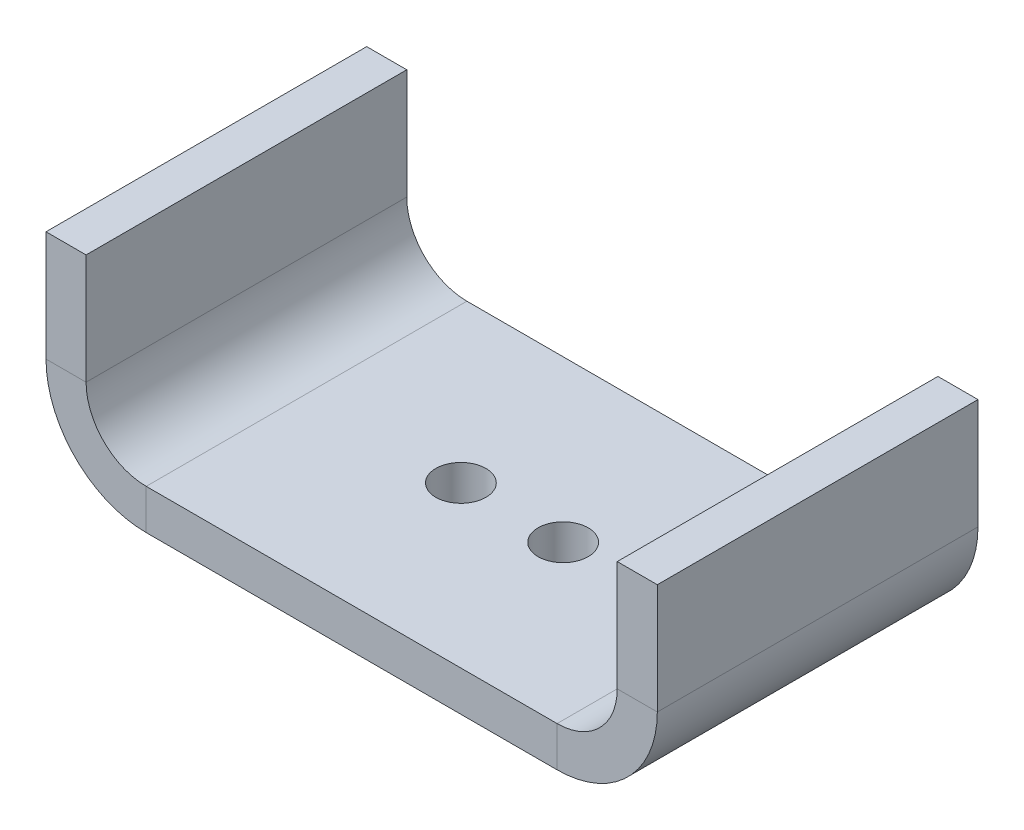
ISO-10303-21;
HEADER;
FILE_DESCRIPTION(('STEP AP214'),'2;1');
FILE_NAME('part.step','',(''),(''),'','','');
FILE_SCHEMA(('AUTOMOTIVE_DESIGN { 1 0 10303 214 1 1 1 1 }'));
ENDSEC;
DATA;
#1=APPLICATION_CONTEXT('core data for automotive mechanical design processes');
#2=APPLICATION_PROTOCOL_DEFINITION('international standard','automotive_design',2000,#1);
#3=PRODUCT_CONTEXT('',#1,'mechanical');
#4=PRODUCT('Part','Part','',(#3));
#5=PRODUCT_RELATED_PRODUCT_CATEGORY('part','',(#4));
#6=PRODUCT_DEFINITION_FORMATION('','',#4);
#7=PRODUCT_DEFINITION_CONTEXT('part definition',#1,'design');
#8=PRODUCT_DEFINITION('design','',#6,#7);
#9=PRODUCT_DEFINITION_SHAPE('','',#8);
#10=(LENGTH_UNIT() NAMED_UNIT(*) SI_UNIT(.MILLI.,.METRE.));
#11=(NAMED_UNIT(*) PLANE_ANGLE_UNIT() SI_UNIT($,.RADIAN.));
#12=(NAMED_UNIT(*) SI_UNIT($,.STERADIAN.) SOLID_ANGLE_UNIT());
#13=UNCERTAINTY_MEASURE_WITH_UNIT(LENGTH_MEASURE(1.E-05),#10,'distance_accuracy_value','');
#14=(GEOMETRIC_REPRESENTATION_CONTEXT(3) GLOBAL_UNCERTAINTY_ASSIGNED_CONTEXT((#13)) GLOBAL_UNIT_ASSIGNED_CONTEXT((#10,
#11,#12)) REPRESENTATION_CONTEXT('',''));
#15=CARTESIAN_POINT('',(0.,0.,0.));
#16=DIRECTION('',(0.,0.,1.));
#17=DIRECTION('',(1.,0.,0.));
#18=AXIS2_PLACEMENT_3D('',#15,#16,#17);
#19=CARTESIAN_POINT('',(-13.8226819267773,9.91819852941176,16.));
#20=DIRECTION('',(0.,0.,1.));
#21=DIRECTION('',(1.,0.,0.));
#22=AXIS2_PLACEMENT_3D('',#19,#20,#21);
#23=PLANE('',#22);
#24=DIRECTION('',(1.,0.,0.));
#25=VECTOR('',#24,1.);
#26=CARTESIAN_POINT('',(-13.8226819267773,9.91819852941176,16.));
#27=LINE('',#26,#25);
#28=CARTESIAN_POINT('',(-13.8226819267773,9.91819852941176,16.));
#29=VERTEX_POINT('',#28);
#30=CARTESIAN_POINT('',(-11.8226819267773,9.91819852941177,16.));
#31=VERTEX_POINT('',#30);
#32=EDGE_CURVE('E11',#29,#31,#27,.T.);
#33=ORIENTED_EDGE('',*,*,#32,.F.);
#34=CARTESIAN_POINT('',(-8.82268192677729,9.91819852941177,16.));
#35=DIRECTION('',(0.,0.,-1.));
#36=DIRECTION('',(-1.,0.,0.));
#37=AXIS2_PLACEMENT_3D('',#34,#35,#36);
#38=CIRCLE('',#37,5.);
#39=CARTESIAN_POINT('',(-8.82268192677729,4.91819852941177,16.));
#40=VERTEX_POINT('',#39);
#41=EDGE_CURVE('E243',#40,#29,#38,.T.);
#42=ORIENTED_EDGE('',*,*,#41,.F.);
#43=DIRECTION('',(0.,-1.,0.));
#44=VECTOR('',#43,1.);
#45=CARTESIAN_POINT('',(-8.82268192677729,6.91819852941177,16.));
#46=LINE('',#45,#44);
#47=CARTESIAN_POINT('',(-8.82268192677729,6.91819852941177,16.));
#48=VERTEX_POINT('',#47);
#49=EDGE_CURVE('E45',#48,#40,#46,.T.);
#50=ORIENTED_EDGE('',*,*,#49,.F.);
#51=CARTESIAN_POINT('',(-8.82268192677729,9.91819852941177,16.));
#52=DIRECTION('',(0.,0.,1.));
#53=DIRECTION('',(1.,0.,0.));
#54=AXIS2_PLACEMENT_3D('',#51,#52,#53);
#55=CIRCLE('',#54,3.);
#56=EDGE_CURVE('E169',#48,#31,#55,.F.);
#57=ORIENTED_EDGE('',*,*,#56,.T.);
#58=EDGE_LOOP('',(#33,#42,#50,#57));
#59=FACE_BOUND('',#58,.T.);
#60=ADVANCED_FACE('F37',(#59),#23,.T.);
#61=CARTESIAN_POINT('',(-8.82268192677729,6.91819852941177,16.));
#62=DIRECTION('',(0.,0.,1.));
#63=DIRECTION('',(1.,0.,0.));
#64=AXIS2_PLACEMENT_3D('',#61,#62,#63);
#65=PLANE('',#64);
#66=DIRECTION('',(0.,1.,0.));
#67=VECTOR('',#66,1.);
#68=CARTESIAN_POINT('',(-13.8226819267773,15.4181985294118,16.));
#69=LINE('',#68,#67);
#70=CARTESIAN_POINT('',(-13.8226819267773,15.4181985294118,16.));
#71=VERTEX_POINT('',#70);
#72=EDGE_CURVE('E247',#29,#71,#69,.T.);
#73=ORIENTED_EDGE('',*,*,#72,.F.);
#74=ORIENTED_EDGE('',*,*,#32,.T.);
#75=DIRECTION('',(0.,1.,0.));
#76=VECTOR('',#75,1.);
#77=CARTESIAN_POINT('',(-11.8226819267773,15.4181985294118,16.));
#78=LINE('',#77,#76);
#79=CARTESIAN_POINT('',(-11.8226819267773,15.4181985294118,16.));
#80=VERTEX_POINT('',#79);
#81=EDGE_CURVE('E105',#31,#80,#78,.T.);
#82=ORIENTED_EDGE('',*,*,#81,.T.);
#83=DIRECTION('',(1.,0.,0.));
#84=VECTOR('',#83,1.);
#85=CARTESIAN_POINT('',(-13.8226819267773,15.4181985294118,16.));
#86=LINE('',#85,#84);
#87=EDGE_CURVE('E556',#71,#80,#86,.T.);
#88=ORIENTED_EDGE('',*,*,#87,.F.);
#89=EDGE_LOOP('',(#73,#74,#82,#88));
#90=FACE_BOUND('',#89,.T.);
#91=ADVANCED_FACE('F296',(#90),#65,.T.);
#92=CARTESIAN_POINT('',(-8.82268192677729,4.91819852941177,0.));
#93=DIRECTION('',(0.,0.,-1.));
#94=DIRECTION('',(-1.,0.,0.));
#95=AXIS2_PLACEMENT_3D('',#92,#93,#94);
#96=PLANE('',#95);
#97=DIRECTION('',(0.,1.,0.));
#98=VECTOR('',#97,1.);
#99=CARTESIAN_POINT('',(-8.82268192677729,4.91819852941177,0.));
#100=LINE('',#99,#98);
#101=CARTESIAN_POINT('',(-8.82268192677729,4.91819852941177,0.));
#102=VERTEX_POINT('',#101);
#103=CARTESIAN_POINT('',(-8.82268192677729,6.91819852941177,0.));
#104=VERTEX_POINT('',#103);
#105=EDGE_CURVE('E92',#102,#104,#100,.T.);
#106=ORIENTED_EDGE('',*,*,#105,.F.);
#107=CARTESIAN_POINT('',(-8.82268192677729,9.91819852941177,0.));
#108=DIRECTION('',(0.,0.,-1.));
#109=DIRECTION('',(-1.,0.,0.));
#110=AXIS2_PLACEMENT_3D('',#107,#108,#109);
#111=CIRCLE('',#110,5.);
#112=CARTESIAN_POINT('',(-13.8226819267773,9.91819852941176,0.));
#113=VERTEX_POINT('',#112);
#114=EDGE_CURVE('E185',#102,#113,#111,.T.);
#115=ORIENTED_EDGE('',*,*,#114,.T.);
#116=DIRECTION('',(-1.,0.,0.));
#117=VECTOR('',#116,1.);
#118=CARTESIAN_POINT('',(-11.8226819267773,9.91819852941177,0.));
#119=LINE('',#118,#117);
#120=CARTESIAN_POINT('',(-11.8226819267773,9.91819852941177,0.));
#121=VERTEX_POINT('',#120);
#122=EDGE_CURVE('E99',#121,#113,#119,.T.);
#123=ORIENTED_EDGE('',*,*,#122,.F.);
#124=CARTESIAN_POINT('',(-8.82268192677729,9.91819852941177,0.));
#125=DIRECTION('',(0.,0.,1.));
#126=DIRECTION('',(1.,0.,0.));
#127=AXIS2_PLACEMENT_3D('',#124,#125,#126);
#128=CIRCLE('',#127,3.);
#129=EDGE_CURVE('E204',#104,#121,#128,.F.);
#130=ORIENTED_EDGE('',*,*,#129,.F.);
#131=EDGE_LOOP('',(#106,#115,#123,#130));
#132=FACE_BOUND('',#131,.T.);
#133=ADVANCED_FACE('F300',(#132),#96,.T.);
#134=CARTESIAN_POINT('',(-11.8226819267773,9.91819852941177,0.));
#135=DIRECTION('',(0.,0.,-1.));
#136=DIRECTION('',(-1.,0.,0.));
#137=AXIS2_PLACEMENT_3D('',#134,#135,#136);
#138=PLANE('',#137);
#139=DIRECTION('',(-1.,0.,0.));
#140=VECTOR('',#139,1.);
#141=CARTESIAN_POINT('',(-13.8226819267773,4.91819852941177,0.));
#142=LINE('',#141,#140);
#143=CARTESIAN_POINT('',(11.6773180732227,4.91819852941177,0.));
#144=VERTEX_POINT('',#143);
#145=EDGE_CURVE('E187',#144,#102,#142,.T.);
#146=ORIENTED_EDGE('',*,*,#145,.T.);
#147=ORIENTED_EDGE('',*,*,#105,.T.);
#148=DIRECTION('',(1.,0.,0.));
#149=VECTOR('',#148,1.);
#150=CARTESIAN_POINT('',(-13.8226819267773,6.91819852941177,0.));
#151=LINE('',#150,#149);
#152=CARTESIAN_POINT('',(11.6773180732227,6.91819852941177,0.));
#153=VERTEX_POINT('',#152);
#154=EDGE_CURVE('E202',#153,#104,#151,.F.);
#155=ORIENTED_EDGE('',*,*,#154,.F.);
#156=DIRECTION('',(0.,-1.,0.));
#157=VECTOR('',#156,1.);
#158=CARTESIAN_POINT('',(11.6773180732227,6.91819852941177,0.));
#159=LINE('',#158,#157);
#160=EDGE_CURVE('E230',#153,#144,#159,.T.);
#161=ORIENTED_EDGE('',*,*,#160,.T.);
#162=EDGE_LOOP('',(#146,#147,#155,#161));
#163=FACE_BOUND('',#162,.T.);
#164=ADVANCED_FACE('F273',(#163),#138,.T.);
#165=CARTESIAN_POINT('',(11.6773180732227,4.91819852941177,16.));
#166=DIRECTION('',(0.,0.,1.));
#167=DIRECTION('',(1.,0.,0.));
#168=AXIS2_PLACEMENT_3D('',#165,#166,#167);
#169=PLANE('',#168);
#170=DIRECTION('',(0.,1.,0.));
#171=VECTOR('',#170,1.);
#172=CARTESIAN_POINT('',(11.6773180732227,4.91819852941177,16.));
#173=LINE('',#172,#171);
#174=CARTESIAN_POINT('',(11.6773180732227,4.91819852941177,16.));
#175=VERTEX_POINT('',#174);
#176=CARTESIAN_POINT('',(11.6773180732227,6.91819852941177,16.));
#177=VERTEX_POINT('',#176);
#178=EDGE_CURVE('E133',#175,#177,#173,.T.);
#179=ORIENTED_EDGE('',*,*,#178,.F.);
#180=CARTESIAN_POINT('',(11.6773180732227,9.91819852941177,16.));
#181=DIRECTION('',(0.,0.,-1.));
#182=DIRECTION('',(-1.,0.,0.));
#183=AXIS2_PLACEMENT_3D('',#180,#181,#182);
#184=CIRCLE('',#183,5.);
#185=CARTESIAN_POINT('',(16.6773180732227,9.91819852941177,16.));
#186=VERTEX_POINT('',#185);
#187=EDGE_CURVE('E250',#186,#175,#184,.T.);
#188=ORIENTED_EDGE('',*,*,#187,.F.);
#189=DIRECTION('',(1.,0.,0.));
#190=VECTOR('',#189,1.);
#191=CARTESIAN_POINT('',(14.6773180732227,9.91819852941177,16.));
#192=LINE('',#191,#190);
#193=CARTESIAN_POINT('',(14.6773180732227,9.91819852941177,16.));
#194=VERTEX_POINT('',#193);
#195=EDGE_CURVE('E145',#194,#186,#192,.T.);
#196=ORIENTED_EDGE('',*,*,#195,.F.);
#197=CARTESIAN_POINT('',(11.6773180732227,9.91819852941177,16.));
#198=DIRECTION('',(0.,0.,1.));
#199=DIRECTION('',(1.,0.,0.));
#200=AXIS2_PLACEMENT_3D('',#197,#198,#199);
#201=CIRCLE('',#200,3.);
#202=EDGE_CURVE('E148',#194,#177,#201,.F.);
#203=ORIENTED_EDGE('',*,*,#202,.T.);
#204=EDGE_LOOP('',(#179,#188,#196,#203));
#205=FACE_BOUND('',#204,.T.);
#206=ADVANCED_FACE('F150',(#205),#169,.T.);
#207=CARTESIAN_POINT('',(14.6773180732227,9.91819852941177,16.));
#208=DIRECTION('',(0.,0.,1.));
#209=DIRECTION('',(1.,0.,0.));
#210=AXIS2_PLACEMENT_3D('',#207,#208,#209);
#211=PLANE('',#210);
#212=DIRECTION('',(-1.,0.,0.));
#213=VECTOR('',#212,1.);
#214=CARTESIAN_POINT('',(-13.8226819267773,4.91819852941177,16.));
#215=LINE('',#214,#213);
#216=EDGE_CURVE('E140',#175,#40,#215,.T.);
#217=ORIENTED_EDGE('',*,*,#216,.F.);
#218=ORIENTED_EDGE('',*,*,#178,.T.);
#219=DIRECTION('',(1.,0.,0.));
#220=VECTOR('',#219,1.);
#221=CARTESIAN_POINT('',(-13.8226819267773,6.91819852941177,16.));
#222=LINE('',#221,#220);
#223=EDGE_CURVE('E137',#177,#48,#222,.F.);
#224=ORIENTED_EDGE('',*,*,#223,.T.);
#225=ORIENTED_EDGE('',*,*,#49,.T.);
#226=EDGE_LOOP('',(#217,#218,#224,#225));
#227=FACE_BOUND('',#226,.T.);
#228=ADVANCED_FACE('F135',(#227),#211,.T.);
#229=CARTESIAN_POINT('',(16.6773180732227,9.91819852941177,0.));
#230=DIRECTION('',(0.,0.,-1.));
#231=DIRECTION('',(-1.,0.,0.));
#232=AXIS2_PLACEMENT_3D('',#229,#230,#231);
#233=PLANE('',#232);
#234=DIRECTION('',(-1.,0.,0.));
#235=VECTOR('',#234,1.);
#236=CARTESIAN_POINT('',(16.6773180732227,9.91819852941177,0.));
#237=LINE('',#236,#235);
#238=CARTESIAN_POINT('',(16.6773180732227,9.91819852941177,0.));
#239=VERTEX_POINT('',#238);
#240=CARTESIAN_POINT('',(14.6773180732227,9.91819852941177,0.));
#241=VERTEX_POINT('',#240);
#242=EDGE_CURVE('E232',#239,#241,#237,.T.);
#243=ORIENTED_EDGE('',*,*,#242,.F.);
#244=CARTESIAN_POINT('',(11.6773180732227,9.91819852941177,0.));
#245=DIRECTION('',(0.,0.,-1.));
#246=DIRECTION('',(-1.,0.,0.));
#247=AXIS2_PLACEMENT_3D('',#244,#245,#246);
#248=CIRCLE('',#247,5.);
#249=EDGE_CURVE('E189',#239,#144,#248,.T.);
#250=ORIENTED_EDGE('',*,*,#249,.T.);
#251=ORIENTED_EDGE('',*,*,#160,.F.);
#252=CARTESIAN_POINT('',(11.6773180732227,9.91819852941177,0.));
#253=DIRECTION('',(0.,0.,1.));
#254=DIRECTION('',(1.,0.,0.));
#255=AXIS2_PLACEMENT_3D('',#252,#253,#254);
#256=CIRCLE('',#255,3.);
#257=EDGE_CURVE('E161',#241,#153,#256,.F.);
#258=ORIENTED_EDGE('',*,*,#257,.F.);
#259=EDGE_LOOP('',(#243,#250,#251,#258));
#260=FACE_BOUND('',#259,.T.);
#261=ADVANCED_FACE('F271',(#260),#233,.T.);
#262=CARTESIAN_POINT('',(11.6773180732227,6.91819852941177,0.));
#263=DIRECTION('',(0.,0.,-1.));
#264=DIRECTION('',(-1.,0.,0.));
#265=AXIS2_PLACEMENT_3D('',#262,#263,#264);
#266=PLANE('',#265);
#267=DIRECTION('',(0.,-1.,0.));
#268=VECTOR('',#267,1.);
#269=CARTESIAN_POINT('',(16.6773180732227,15.4181985294118,0.));
#270=LINE('',#269,#268);
#271=CARTESIAN_POINT('',(16.6773180732227,15.4181985294118,0.));
#272=VERTEX_POINT('',#271);
#273=EDGE_CURVE('E192',#272,#239,#270,.T.);
#274=ORIENTED_EDGE('',*,*,#273,.T.);
#275=ORIENTED_EDGE('',*,*,#242,.T.);
#276=DIRECTION('',(0.,-1.,0.));
#277=VECTOR('',#276,1.);
#278=CARTESIAN_POINT('',(14.6773180732227,15.4181985294118,0.));
#279=LINE('',#278,#277);
#280=CARTESIAN_POINT('',(14.6773180732227,15.4181985294118,0.));
#281=VERTEX_POINT('',#280);
#282=EDGE_CURVE('E198',#281,#241,#279,.T.);
#283=ORIENTED_EDGE('',*,*,#282,.F.);
#284=DIRECTION('',(1.,0.,0.));
#285=VECTOR('',#284,1.);
#286=CARTESIAN_POINT('',(14.6773180732227,15.4181985294118,0.));
#287=LINE('',#286,#285);
#288=EDGE_CURVE('E195',#281,#272,#287,.T.);
#289=ORIENTED_EDGE('',*,*,#288,.T.);
#290=EDGE_LOOP('',(#274,#275,#283,#289));
#291=FACE_BOUND('',#290,.T.);
#292=ADVANCED_FACE('F283',(#291),#266,.T.);
#293=CARTESIAN_POINT('',(-11.8226819267773,15.4181985294118,16.));
#294=DIRECTION('',(-1.,0.,0.));
#295=DIRECTION('',(0.,-1.,0.));
#296=AXIS2_PLACEMENT_3D('',#293,#294,#295);
#297=PLANE('',#296);
#298=DIRECTION('',(0.,1.,0.));
#299=VECTOR('',#298,1.);
#300=CARTESIAN_POINT('',(-11.8226819267773,15.4181985294118,0.));
#301=LINE('',#300,#299);
#302=CARTESIAN_POINT('',(-11.8226819267773,15.4181985294118,0.));
#303=VERTEX_POINT('',#302);
#304=EDGE_CURVE('E175',#121,#303,#301,.T.);
#305=ORIENTED_EDGE('',*,*,#304,.T.);
#306=DIRECTION('',(0.,0.,-1.));
#307=VECTOR('',#306,1.);
#308=CARTESIAN_POINT('',(-11.8226819267773,15.4181985294118,16.));
#309=LINE('',#308,#307);
#310=EDGE_CURVE('E228',#80,#303,#309,.T.);
#311=ORIENTED_EDGE('',*,*,#310,.F.);
#312=ORIENTED_EDGE('',*,*,#81,.F.);
#313=DIRECTION('',(0.,0.,-1.));
#314=VECTOR('',#313,1.);
#315=CARTESIAN_POINT('',(-11.8226819267773,9.91819852941177,16.));
#316=LINE('',#315,#314);
#317=EDGE_CURVE('E171',#31,#121,#316,.T.);
#318=ORIENTED_EDGE('',*,*,#317,.T.);
#319=EDGE_LOOP('',(#305,#311,#312,#318));
#320=FACE_BOUND('',#319,.T.);
#321=ADVANCED_FACE('F285',(#320),#297,.F.);
#322=CARTESIAN_POINT('',(-13.8226819267773,15.4181985294118,16.));
#323=DIRECTION('',(0.,1.,0.));
#324=DIRECTION('',(-1.,0.,0.));
#325=AXIS2_PLACEMENT_3D('',#322,#323,#324);
#326=PLANE('',#325);
#327=DIRECTION('',(1.,0.,0.));
#328=VECTOR('',#327,1.);
#329=CARTESIAN_POINT('',(-13.8226819267773,15.4181985294118,0.));
#330=LINE('',#329,#328);
#331=CARTESIAN_POINT('',(-13.8226819267773,15.4181985294118,0.));
#332=VERTEX_POINT('',#331);
#333=EDGE_CURVE('E178',#332,#303,#330,.T.);
#334=ORIENTED_EDGE('',*,*,#333,.F.);
#335=DIRECTION('',(0.,0.,-1.));
#336=VECTOR('',#335,1.);
#337=CARTESIAN_POINT('',(-13.8226819267773,15.4181985294118,16.));
#338=LINE('',#337,#336);
#339=EDGE_CURVE('E226',#71,#332,#338,.T.);
#340=ORIENTED_EDGE('',*,*,#339,.F.);
#341=ORIENTED_EDGE('',*,*,#87,.T.);
#342=ORIENTED_EDGE('',*,*,#310,.T.);
#343=EDGE_LOOP('',(#334,#340,#341,#342));
#344=FACE_BOUND('',#343,.T.);
#345=ADVANCED_FACE('F291',(#344),#326,.T.);
#346=CARTESIAN_POINT('',(-13.8226819267773,15.4181985294118,16.));
#347=DIRECTION('',(-1.,0.,0.));
#348=DIRECTION('',(0.,-1.,0.));
#349=AXIS2_PLACEMENT_3D('',#346,#347,#348);
#350=PLANE('',#349);
#351=DIRECTION('',(0.,1.,0.));
#352=VECTOR('',#351,1.);
#353=CARTESIAN_POINT('',(-13.8226819267773,15.4181985294118,0.));
#354=LINE('',#353,#352);
#355=EDGE_CURVE('E182',#113,#332,#354,.T.);
#356=ORIENTED_EDGE('',*,*,#355,.F.);
#357=DIRECTION('',(0.,0.,-1.));
#358=VECTOR('',#357,1.);
#359=CARTESIAN_POINT('',(-13.8226819267773,9.91819852941176,16.));
#360=LINE('',#359,#358);
#361=EDGE_CURVE('E223',#29,#113,#360,.T.);
#362=ORIENTED_EDGE('',*,*,#361,.F.);
#363=ORIENTED_EDGE('',*,*,#72,.T.);
#364=ORIENTED_EDGE('',*,*,#339,.T.);
#365=EDGE_LOOP('',(#356,#362,#363,#364));
#366=FACE_BOUND('',#365,.T.);
#367=ADVANCED_FACE('F341',(#366),#350,.T.);
#368=CARTESIAN_POINT('',(-8.82268192677729,9.91819852941177,16.));
#369=DIRECTION('',(0.,0.,-1.));
#370=DIRECTION('',(-1.,0.,0.));
#371=AXIS2_PLACEMENT_3D('',#368,#369,#370);
#372=CYLINDRICAL_SURFACE('',#371,5.);
#373=ORIENTED_EDGE('',*,*,#114,.F.);
#374=DIRECTION('',(0.,0.,-1.));
#375=VECTOR('',#374,1.);
#376=CARTESIAN_POINT('',(-8.82268192677729,4.91819852941177,16.));
#377=LINE('',#376,#375);
#378=EDGE_CURVE('E220',#40,#102,#377,.T.);
#379=ORIENTED_EDGE('',*,*,#378,.F.);
#380=ORIENTED_EDGE('',*,*,#41,.T.);
#381=ORIENTED_EDGE('',*,*,#361,.T.);
#382=EDGE_LOOP('',(#373,#379,#380,#381));
#383=FACE_BOUND('',#382,.T.);
#384=ADVANCED_FACE('F242',(#383),#372,.T.);
#385=CARTESIAN_POINT('',(-13.8226819267773,4.91819852941177,16.));
#386=DIRECTION('',(0.,-1.,0.));
#387=DIRECTION('',(0.,0.,-1.));
#388=AXIS2_PLACEMENT_3D('',#385,#386,#387);
#389=PLANE('',#388);
#390=CARTESIAN_POINT('',(3.99281207127262,4.91819852941177,8.01395442716519));
#391=DIRECTION('',(0.,1.,0.));
#392=DIRECTION('',(0.,0.,1.));
#393=AXIS2_PLACEMENT_3D('',#390,#391,#392);
#394=CIRCLE('',#393,1.25);
#395=CARTESIAN_POINT('',(3.99281207127262,4.91819852941177,9.26395442716519));
#396=VERTEX_POINT('',#395);
#397=EDGE_CURVE('E179',#396,#396,#394,.T.);
#398=ORIENTED_EDGE('',*,*,#397,.T.);
#399=EDGE_LOOP('',(#398));
#400=FACE_BOUND('',#399,.T.);
#401=CARTESIAN_POINT('',(-1.12268192677729,4.91819852941177,8.));
#402=DIRECTION('',(0.,1.,0.));
#403=DIRECTION('',(0.,0.,1.));
#404=AXIS2_PLACEMENT_3D('',#401,#402,#403);
#405=CIRCLE('',#404,1.25);
#406=CARTESIAN_POINT('',(-1.12268192677729,4.91819852941177,9.25));
#407=VERTEX_POINT('',#406);
#408=EDGE_CURVE('E546',#407,#407,#405,.T.);
#409=ORIENTED_EDGE('',*,*,#408,.T.);
#410=EDGE_LOOP('',(#409));
#411=FACE_BOUND('',#410,.T.);
#412=ORIENTED_EDGE('',*,*,#145,.F.);
#413=DIRECTION('',(0.,0.,-1.));
#414=VECTOR('',#413,1.);
#415=CARTESIAN_POINT('',(11.6773180732227,4.91819852941177,16.));
#416=LINE('',#415,#414);
#417=EDGE_CURVE('E217',#175,#144,#416,.T.);
#418=ORIENTED_EDGE('',*,*,#417,.F.);
#419=ORIENTED_EDGE('',*,*,#216,.T.);
#420=ORIENTED_EDGE('',*,*,#378,.T.);
#421=EDGE_LOOP('',(#412,#418,#419,#420));
#422=FACE_BOUND('',#421,.T.);
#423=ADVANCED_FACE('F249',(#400,#411,#422),#389,.T.);
#424=CARTESIAN_POINT('',(11.6773180732227,9.91819852941177,16.));
#425=DIRECTION('',(0.,0.,-1.));
#426=DIRECTION('',(-1.,0.,0.));
#427=AXIS2_PLACEMENT_3D('',#424,#425,#426);
#428=CYLINDRICAL_SURFACE('',#427,5.);
#429=ORIENTED_EDGE('',*,*,#249,.F.);
#430=DIRECTION('',(0.,0.,-1.));
#431=VECTOR('',#430,1.);
#432=CARTESIAN_POINT('',(16.6773180732227,9.91819852941177,16.));
#433=LINE('',#432,#431);
#434=EDGE_CURVE('E214',#186,#239,#433,.T.);
#435=ORIENTED_EDGE('',*,*,#434,.F.);
#436=ORIENTED_EDGE('',*,*,#187,.T.);
#437=ORIENTED_EDGE('',*,*,#417,.T.);
#438=EDGE_LOOP('',(#429,#435,#436,#437));
#439=FACE_BOUND('',#438,.T.);
#440=ADVANCED_FACE('F275',(#439),#428,.T.);
#441=CARTESIAN_POINT('',(16.6773180732227,15.4181985294118,16.));
#442=DIRECTION('',(1.,0.,0.));
#443=DIRECTION('',(0.,1.,0.));
#444=AXIS2_PLACEMENT_3D('',#441,#442,#443);
#445=PLANE('',#444);
#446=ORIENTED_EDGE('',*,*,#273,.F.);
#447=DIRECTION('',(0.,0.,-1.));
#448=VECTOR('',#447,1.);
#449=CARTESIAN_POINT('',(16.6773180732227,15.4181985294118,16.));
#450=LINE('',#449,#448);
#451=CARTESIAN_POINT('',(16.6773180732227,15.4181985294118,16.));
#452=VERTEX_POINT('',#451);
#453=EDGE_CURVE('E212',#452,#272,#450,.T.);
#454=ORIENTED_EDGE('',*,*,#453,.F.);
#455=DIRECTION('',(0.,-1.,0.));
#456=VECTOR('',#455,1.);
#457=CARTESIAN_POINT('',(16.6773180732227,15.4181985294118,16.));
#458=LINE('',#457,#456);
#459=EDGE_CURVE('E252',#452,#186,#458,.T.);
#460=ORIENTED_EDGE('',*,*,#459,.T.);
#461=ORIENTED_EDGE('',*,*,#434,.T.);
#462=EDGE_LOOP('',(#446,#454,#460,#461));
#463=FACE_BOUND('',#462,.T.);
#464=ADVANCED_FACE('F278',(#463),#445,.T.);
#465=CARTESIAN_POINT('',(14.6773180732227,15.4181985294118,16.));
#466=DIRECTION('',(0.,1.,0.));
#467=DIRECTION('',(0.,0.,1.));
#468=AXIS2_PLACEMENT_3D('',#465,#466,#467);
#469=PLANE('',#468);
#470=ORIENTED_EDGE('',*,*,#288,.F.);
#471=DIRECTION('',(0.,0.,-1.));
#472=VECTOR('',#471,1.);
#473=CARTESIAN_POINT('',(14.6773180732227,15.4181985294118,16.));
#474=LINE('',#473,#472);
#475=CARTESIAN_POINT('',(14.6773180732227,15.4181985294118,16.));
#476=VERTEX_POINT('',#475);
#477=EDGE_CURVE('E210',#476,#281,#474,.T.);
#478=ORIENTED_EDGE('',*,*,#477,.F.);
#479=DIRECTION('',(1.,0.,0.));
#480=VECTOR('',#479,1.);
#481=CARTESIAN_POINT('',(14.6773180732227,15.4181985294118,16.));
#482=LINE('',#481,#480);
#483=EDGE_CURVE('E258',#476,#452,#482,.T.);
#484=ORIENTED_EDGE('',*,*,#483,.T.);
#485=ORIENTED_EDGE('',*,*,#453,.T.);
#486=EDGE_LOOP('',(#470,#478,#484,#485));
#487=FACE_BOUND('',#486,.T.);
#488=ADVANCED_FACE('F281',(#487),#469,.T.);
#489=CARTESIAN_POINT('',(14.6773180732227,15.4181985294118,16.));
#490=DIRECTION('',(1.,0.,0.));
#491=DIRECTION('',(0.,1.,0.));
#492=AXIS2_PLACEMENT_3D('',#489,#490,#491);
#493=PLANE('',#492);
#494=ORIENTED_EDGE('',*,*,#282,.T.);
#495=DIRECTION('',(0.,0.,-1.));
#496=VECTOR('',#495,1.);
#497=CARTESIAN_POINT('',(14.6773180732227,9.91819852941177,16.));
#498=LINE('',#497,#496);
#499=EDGE_CURVE('E163',#194,#241,#498,.T.);
#500=ORIENTED_EDGE('',*,*,#499,.F.);
#501=DIRECTION('',(0.,-1.,0.));
#502=VECTOR('',#501,1.);
#503=CARTESIAN_POINT('',(14.6773180732227,15.4181985294118,16.));
#504=LINE('',#503,#502);
#505=EDGE_CURVE('E154',#476,#194,#504,.T.);
#506=ORIENTED_EDGE('',*,*,#505,.F.);
#507=ORIENTED_EDGE('',*,*,#477,.T.);
#508=EDGE_LOOP('',(#494,#500,#506,#507));
#509=FACE_BOUND('',#508,.T.);
#510=ADVANCED_FACE('F268',(#509),#493,.F.);
#511=CARTESIAN_POINT('',(11.6773180732227,9.91819852941177,16.));
#512=DIRECTION('',(0.,0.,-1.));
#513=DIRECTION('',(-1.,0.,0.));
#514=AXIS2_PLACEMENT_3D('',#511,#512,#513);
#515=CYLINDRICAL_SURFACE('',#514,3.);
#516=ORIENTED_EDGE('',*,*,#257,.T.);
#517=DIRECTION('',(0.,0.,-1.));
#518=VECTOR('',#517,1.);
#519=CARTESIAN_POINT('',(11.6773180732227,6.91819852941177,16.));
#520=LINE('',#519,#518);
#521=EDGE_CURVE('E158',#177,#153,#520,.T.);
#522=ORIENTED_EDGE('',*,*,#521,.F.);
#523=ORIENTED_EDGE('',*,*,#202,.F.);
#524=ORIENTED_EDGE('',*,*,#499,.T.);
#525=EDGE_LOOP('',(#516,#522,#523,#524));
#526=FACE_BOUND('',#525,.T.);
#527=ADVANCED_FACE('F159',(#526),#515,.F.);
#528=CARTESIAN_POINT('',(-13.8226819267773,6.91819852941177,16.));
#529=DIRECTION('',(0.,-1.,0.));
#530=DIRECTION('',(0.,0.,-1.));
#531=AXIS2_PLACEMENT_3D('',#528,#529,#530);
#532=PLANE('',#531);
#533=CARTESIAN_POINT('',(3.99281207127262,6.91819852941177,8.01395442716519));
#534=DIRECTION('',(0.,1.,0.));
#535=DIRECTION('',(0.,0.,1.));
#536=AXIS2_PLACEMENT_3D('',#533,#534,#535);
#537=CIRCLE('',#536,1.25);
#538=CARTESIAN_POINT('',(3.99281207127262,6.91819852941177,9.26395442716519));
#539=VERTEX_POINT('',#538);
#540=EDGE_CURVE('E545',#539,#539,#537,.T.);
#541=ORIENTED_EDGE('',*,*,#540,.F.);
#542=EDGE_LOOP('',(#541));
#543=FACE_BOUND('',#542,.T.);
#544=CARTESIAN_POINT('',(-1.12268192677729,6.91819852941177,8.));
#545=DIRECTION('',(0.,1.,0.));
#546=DIRECTION('',(0.,0.,1.));
#547=AXIS2_PLACEMENT_3D('',#544,#545,#546);
#548=CIRCLE('',#547,1.25);
#549=CARTESIAN_POINT('',(-1.12268192677729,6.91819852941177,9.25));
#550=VERTEX_POINT('',#549);
#551=EDGE_CURVE('E550',#550,#550,#548,.T.);
#552=ORIENTED_EDGE('',*,*,#551,.F.);
#553=EDGE_LOOP('',(#552));
#554=FACE_BOUND('',#553,.T.);
#555=ORIENTED_EDGE('',*,*,#154,.T.);
#556=DIRECTION('',(0.,0.,-1.));
#557=VECTOR('',#556,1.);
#558=CARTESIAN_POINT('',(-8.82268192677729,6.91819852941177,16.));
#559=LINE('',#558,#557);
#560=EDGE_CURVE('E164',#48,#104,#559,.T.);
#561=ORIENTED_EDGE('',*,*,#560,.F.);
#562=ORIENTED_EDGE('',*,*,#223,.F.);
#563=ORIENTED_EDGE('',*,*,#521,.T.);
#564=EDGE_LOOP('',(#555,#561,#562,#563));
#565=FACE_BOUND('',#564,.T.);
#566=ADVANCED_FACE('F166',(#543,#554,#565),#532,.F.);
#567=CARTESIAN_POINT('',(-8.82268192677729,9.91819852941177,16.));
#568=DIRECTION('',(0.,0.,-1.));
#569=DIRECTION('',(-1.,0.,0.));
#570=AXIS2_PLACEMENT_3D('',#567,#568,#569);
#571=CYLINDRICAL_SURFACE('',#570,3.);
#572=ORIENTED_EDGE('',*,*,#129,.T.);
#573=ORIENTED_EDGE('',*,*,#317,.F.);
#574=ORIENTED_EDGE('',*,*,#56,.F.);
#575=ORIENTED_EDGE('',*,*,#560,.T.);
#576=EDGE_LOOP('',(#572,#573,#574,#575));
#577=FACE_BOUND('',#576,.T.);
#578=ADVANCED_FACE('F416',(#577),#571,.F.);
#579=CARTESIAN_POINT('',(-8.82268192677729,9.91819852941177,16.));
#580=DIRECTION('',(0.,0.,-1.));
#581=DIRECTION('',(-1.,0.,0.));
#582=AXIS2_PLACEMENT_3D('',#579,#580,#581);
#583=PLANE('',#582);
#584=ORIENTED_EDGE('',*,*,#505,.T.);
#585=ORIENTED_EDGE('',*,*,#195,.T.);
#586=ORIENTED_EDGE('',*,*,#459,.F.);
#587=ORIENTED_EDGE('',*,*,#483,.F.);
#588=EDGE_LOOP('',(#584,#585,#586,#587));
#589=FACE_BOUND('',#588,.T.);
#590=ADVANCED_FACE('F264',(#589),#583,.F.);
#591=CARTESIAN_POINT('',(-8.82268192677729,9.91819852941177,0.));
#592=DIRECTION('',(0.,0.,-1.));
#593=DIRECTION('',(-1.,0.,0.));
#594=AXIS2_PLACEMENT_3D('',#591,#592,#593);
#595=PLANE('',#594);
#596=ORIENTED_EDGE('',*,*,#304,.F.);
#597=ORIENTED_EDGE('',*,*,#122,.T.);
#598=ORIENTED_EDGE('',*,*,#355,.T.);
#599=ORIENTED_EDGE('',*,*,#333,.T.);
#600=EDGE_LOOP('',(#596,#597,#598,#599));
#601=FACE_BOUND('',#600,.T.);
#602=ADVANCED_FACE('F431',(#601),#595,.T.);
#603=CARTESIAN_POINT('',(-1.12268192677729,4.91819852941177,8.));
#604=DIRECTION('',(0.,1.,0.));
#605=DIRECTION('',(0.,0.,1.));
#606=AXIS2_PLACEMENT_3D('',#603,#604,#605);
#607=CYLINDRICAL_SURFACE('',#606,1.25);
#608=ORIENTED_EDGE('',*,*,#408,.F.);
#609=EDGE_LOOP('',(#608));
#610=FACE_BOUND('',#609,.T.);
#611=ORIENTED_EDGE('',*,*,#551,.T.);
#612=EDGE_LOOP('',(#611));
#613=FACE_BOUND('',#612,.T.);
#614=ADVANCED_FACE('F441',(#610,#613),#607,.F.);
#615=CARTESIAN_POINT('',(3.99281207127262,4.91819852941177,8.01395442716519));
#616=DIRECTION('',(0.,1.,0.));
#617=DIRECTION('',(0.,0.,1.));
#618=AXIS2_PLACEMENT_3D('',#615,#616,#617);
#619=CYLINDRICAL_SURFACE('',#618,1.25);
#620=ORIENTED_EDGE('',*,*,#397,.F.);
#621=EDGE_LOOP('',(#620));
#622=FACE_BOUND('',#621,.T.);
#623=ORIENTED_EDGE('',*,*,#540,.T.);
#624=EDGE_LOOP('',(#623));
#625=FACE_BOUND('',#624,.T.);
#626=ADVANCED_FACE('F468',(#622,#625),#619,.F.);
#627=CLOSED_SHELL('',(#60,#91,#133,#164,#206,#228,#261,#292,#321,#345,#367,#384,#423,#440,#464,
#488,#510,#527,#566,#578,#590,#602,#614,#626));
#628=MANIFOLD_SOLID_BREP('B2',#627);
#629=ADVANCED_BREP_SHAPE_REPRESENTATION('',(#18,#628),#14);
#630=SHAPE_DEFINITION_REPRESENTATION(#9,#629);
ENDSEC;
END-ISO-10303-21;
